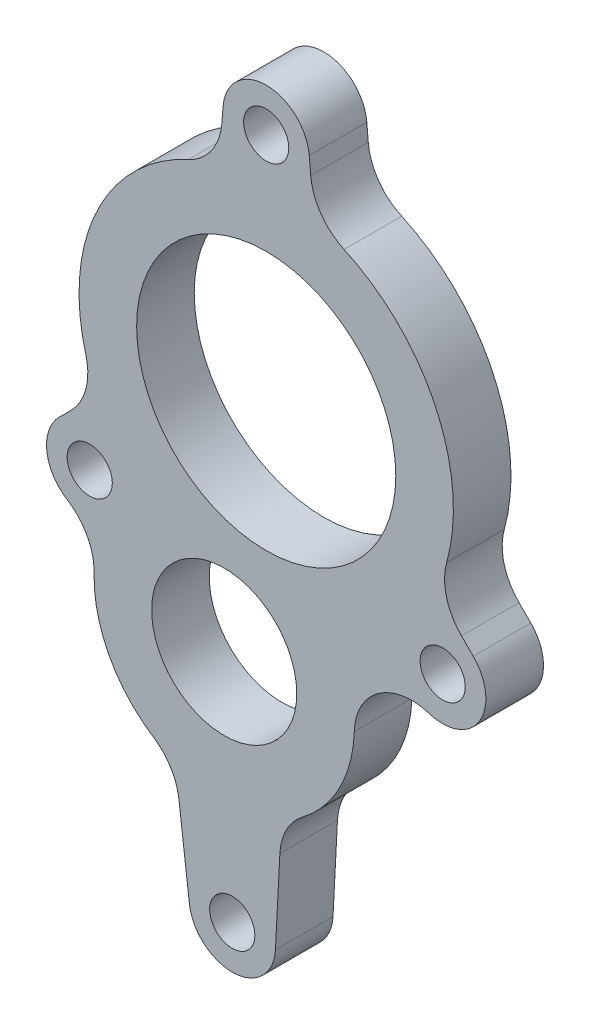
ISO-10303-21;
HEADER;
FILE_DESCRIPTION(('STEP AP214'),'2;1');
FILE_NAME('part.step','',(''),(''),'','','');
FILE_SCHEMA(('AUTOMOTIVE_DESIGN { 1 0 10303 214 1 1 1 1 }'));
ENDSEC;
DATA;
#1=APPLICATION_CONTEXT('core data for automotive mechanical design processes');
#2=APPLICATION_PROTOCOL_DEFINITION('international standard','automotive_design',2000,#1);
#3=PRODUCT_CONTEXT('',#1,'mechanical');
#4=PRODUCT('Part','Part','',(#3));
#5=PRODUCT_RELATED_PRODUCT_CATEGORY('part','',(#4));
#6=PRODUCT_DEFINITION_FORMATION('','',#4);
#7=PRODUCT_DEFINITION_CONTEXT('part definition',#1,'design');
#8=PRODUCT_DEFINITION('design','',#6,#7);
#9=PRODUCT_DEFINITION_SHAPE('','',#8);
#10=(LENGTH_UNIT() NAMED_UNIT(*) SI_UNIT(.MILLI.,.METRE.));
#11=(NAMED_UNIT(*) PLANE_ANGLE_UNIT() SI_UNIT($,.RADIAN.));
#12=(NAMED_UNIT(*) SI_UNIT($,.STERADIAN.) SOLID_ANGLE_UNIT());
#13=UNCERTAINTY_MEASURE_WITH_UNIT(LENGTH_MEASURE(1.E-05),#10,'distance_accuracy_value','');
#14=(GEOMETRIC_REPRESENTATION_CONTEXT(3) GLOBAL_UNCERTAINTY_ASSIGNED_CONTEXT((#13)) GLOBAL_UNIT_ASSIGNED_CONTEXT((#10,
#11,#12)) REPRESENTATION_CONTEXT('',''));
#15=CARTESIAN_POINT('',(0.,0.,0.));
#16=DIRECTION('',(0.,0.,1.));
#17=DIRECTION('',(1.,0.,0.));
#18=AXIS2_PLACEMENT_3D('',#15,#16,#17);
#19=CARTESIAN_POINT('',(-19.457528855222,-16.3268052860382,3.175));
#20=DIRECTION('',(0.,0.,-1.));
#21=DIRECTION('',(-1.,0.,0.));
#22=AXIS2_PLACEMENT_3D('',#19,#20,#21);
#23=CYLINDRICAL_SURFACE('',#22,4.76250000000001);
#24=CARTESIAN_POINT('',(-19.457528855222,-16.3268052860382,-3.175));
#25=DIRECTION('',(0.,0.,1.));
#26=DIRECTION('',(1.,0.,0.));
#27=AXIS2_PLACEMENT_3D('',#24,#25,#26);
#28=CIRCLE('',#27,4.76250000000001);
#29=CARTESIAN_POINT('',(-22.8251249006229,-12.9592092406373,-3.175));
#30=VERTEX_POINT('',#29);
#31=CARTESIAN_POINT('',(-21.9726887974104,-20.3709834120869,-3.175));
#32=VERTEX_POINT('',#31);
#33=EDGE_CURVE('E345',#30,#32,#28,.T.);
#34=ORIENTED_EDGE('',*,*,#33,.T.);
#35=DIRECTION('',(0.,0.,-1.));
#36=VECTOR('',#35,1.);
#37=CARTESIAN_POINT('',(-21.9726887974104,-20.3709834120869,3.175));
#38=LINE('',#37,#36);
#39=CARTESIAN_POINT('',(-21.9726887974104,-20.3709834120869,3.175));
#40=VERTEX_POINT('',#39);
#41=EDGE_CURVE('E395',#32,#40,#38,.F.);
#42=ORIENTED_EDGE('',*,*,#41,.T.);
#43=CARTESIAN_POINT('',(-19.457528855222,-16.3268052860382,3.175));
#44=DIRECTION('',(0.,0.,1.));
#45=DIRECTION('',(1.,0.,0.));
#46=AXIS2_PLACEMENT_3D('',#43,#44,#45);
#47=CIRCLE('',#46,4.76250000000001);
#48=CARTESIAN_POINT('',(-22.8251249006229,-12.9592092406373,3.175));
#49=VERTEX_POINT('',#48);
#50=EDGE_CURVE('E299',#49,#40,#47,.T.);
#51=ORIENTED_EDGE('',*,*,#50,.F.);
#52=DIRECTION('',(0.,0.,-1.));
#53=VECTOR('',#52,1.);
#54=CARTESIAN_POINT('',(-22.8251249006229,-12.9592092406373,3.175));
#55=LINE('',#54,#53);
#56=EDGE_CURVE('E370',#49,#30,#55,.T.);
#57=ORIENTED_EDGE('',*,*,#56,.T.);
#58=EDGE_LOOP('',(#34,#42,#51,#57));
#59=FACE_BOUND('',#58,.T.);
#60=ADVANCED_FACE('F47',(#59),#23,.T.);
#61=CARTESIAN_POINT('',(0.,0.,3.175));
#62=DIRECTION('',(0.,0.,-1.));
#63=DIRECTION('',(-1.,0.,0.));
#64=AXIS2_PLACEMENT_3D('',#61,#62,#63);
#65=CYLINDRICAL_SURFACE('',#64,20.6375);
#66=CARTESIAN_POINT('',(0.,0.,-3.175));
#67=DIRECTION('',(0.,0.,1.));
#68=DIRECTION('',(1.,0.,0.));
#69=AXIS2_PLACEMENT_3D('',#66,#67,#68);
#70=CIRCLE('',#69,20.6375);
#71=CARTESIAN_POINT('',(19.8955843924159,-5.48380597160928,-3.175));
#72=VERTEX_POINT('',#71);
#73=CARTESIAN_POINT('',(8.58779604322396,18.7658243988903,-3.175));
#74=VERTEX_POINT('',#73);
#75=EDGE_CURVE('E326',#72,#74,#70,.T.);
#76=ORIENTED_EDGE('',*,*,#75,.T.);
#77=DIRECTION('',(0.,0.,-1.));
#78=VECTOR('',#77,1.);
#79=CARTESIAN_POINT('',(8.58779604322396,18.7658243988903,3.175));
#80=LINE('',#79,#78);
#81=CARTESIAN_POINT('',(8.58779604322396,18.7658243988903,3.175));
#82=VERTEX_POINT('',#81);
#83=EDGE_CURVE('E420',#74,#82,#80,.F.);
#84=ORIENTED_EDGE('',*,*,#83,.T.);
#85=CARTESIAN_POINT('',(0.,0.,3.175));
#86=DIRECTION('',(0.,0.,1.));
#87=DIRECTION('',(1.,0.,0.));
#88=AXIS2_PLACEMENT_3D('',#85,#86,#87);
#89=CIRCLE('',#88,20.6375);
#90=CARTESIAN_POINT('',(19.8955843924159,-5.48380597160928,3.175));
#91=VERTEX_POINT('',#90);
#92=EDGE_CURVE('E279',#91,#82,#89,.T.);
#93=ORIENTED_EDGE('',*,*,#92,.F.);
#94=DIRECTION('',(0.,0.,-1.));
#95=VECTOR('',#94,1.);
#96=CARTESIAN_POINT('',(19.8955843924159,-5.48380597160928,3.175));
#97=LINE('',#96,#95);
#98=EDGE_CURVE('E416',#91,#72,#97,.T.);
#99=ORIENTED_EDGE('',*,*,#98,.T.);
#100=EDGE_LOOP('',(#76,#84,#93,#99));
#101=FACE_BOUND('',#100,.T.);
#102=ADVANCED_FACE('F482',(#101),#65,.T.);
#103=CARTESIAN_POINT('',(6.94970910603179,0.608020761580617,3.175));
#104=DIRECTION('',(0.996194698091746,0.0871557427476514,0.));
#105=DIRECTION('',(-0.0871557427476514,0.996194698091746,0.));
#106=AXIS2_PLACEMENT_3D('',#103,#104,#105);
#107=PLANE('',#106);
#108=DIRECTION('',(0.0871557427476514,-0.996194698091746,0.));
#109=VECTOR('',#108,1.);
#110=CARTESIAN_POINT('',(6.94970910603179,0.608020761580617,3.175));
#111=LINE('',#110,#109);
#112=CARTESIAN_POINT('',(4.74437724966195,25.8150792248357,3.175));
#113=VERTEX_POINT('',#112);
#114=CARTESIAN_POINT('',(4.90435849287182,23.9864852474859,3.175));
#115=VERTEX_POINT('',#114);
#116=EDGE_CURVE('E284',#113,#115,#111,.T.);
#117=ORIENTED_EDGE('',*,*,#116,.T.);
#118=DIRECTION('',(0.,0.,-1.));
#119=VECTOR('',#118,1.);
#120=CARTESIAN_POINT('',(4.90435849287182,23.9864852474859,3.175));
#121=LINE('',#120,#119);
#122=CARTESIAN_POINT('',(4.90435849287182,23.9864852474859,-3.175));
#123=VERTEX_POINT('',#122);
#124=EDGE_CURVE('E412',#115,#123,#121,.T.);
#125=ORIENTED_EDGE('',*,*,#124,.T.);
#126=DIRECTION('',(0.0871557427476514,-0.996194698091746,0.));
#127=VECTOR('',#126,1.);
#128=CARTESIAN_POINT('',(6.94970910603179,0.608020761580617,-3.175));
#129=LINE('',#128,#127);
#130=CARTESIAN_POINT('',(4.74437724966195,25.8150792248357,-3.175));
#131=VERTEX_POINT('',#130);
#132=EDGE_CURVE('E330',#131,#123,#129,.T.);
#133=ORIENTED_EDGE('',*,*,#132,.F.);
#134=DIRECTION('',(0.,0.,-1.));
#135=VECTOR('',#134,1.);
#136=CARTESIAN_POINT('',(4.74437724966195,25.8150792248357,3.175));
#137=LINE('',#136,#135);
#138=EDGE_CURVE('E378',#113,#131,#137,.T.);
#139=ORIENTED_EDGE('',*,*,#138,.F.);
#140=EDGE_LOOP('',(#117,#125,#133,#139));
#141=FACE_BOUND('',#140,.T.);
#142=ADVANCED_FACE('F489',(#141),#107,.T.);
#143=CARTESIAN_POINT('',(0.,25.4,3.175));
#144=DIRECTION('',(0.,0.,-1.));
#145=DIRECTION('',(-1.,0.,0.));
#146=AXIS2_PLACEMENT_3D('',#143,#144,#145);
#147=CYLINDRICAL_SURFACE('',#146,4.76250000000001);
#148=CARTESIAN_POINT('',(0.,25.4,-3.175));
#149=DIRECTION('',(0.,0.,1.));
#150=DIRECTION('',(1.,0.,0.));
#151=AXIS2_PLACEMENT_3D('',#148,#149,#150);
#152=CIRCLE('',#151,4.76250000000001);
#153=CARTESIAN_POINT('',(-4.74437724966195,25.8150792248357,-3.175));
#154=VERTEX_POINT('',#153);
#155=EDGE_CURVE('E335',#131,#154,#152,.T.);
#156=ORIENTED_EDGE('',*,*,#155,.T.);
#157=DIRECTION('',(0.,0.,-1.));
#158=VECTOR('',#157,1.);
#159=CARTESIAN_POINT('',(-4.74437724966195,25.8150792248357,3.175));
#160=LINE('',#159,#158);
#161=CARTESIAN_POINT('',(-4.74437724966195,25.8150792248357,3.175));
#162=VERTEX_POINT('',#161);
#163=EDGE_CURVE('E374',#162,#154,#160,.T.);
#164=ORIENTED_EDGE('',*,*,#163,.F.);
#165=CARTESIAN_POINT('',(0.,25.4,3.175));
#166=DIRECTION('',(0.,0.,1.));
#167=DIRECTION('',(1.,0.,0.));
#168=AXIS2_PLACEMENT_3D('',#165,#166,#167);
#169=CIRCLE('',#168,4.76250000000001);
#170=EDGE_CURVE('E289',#113,#162,#169,.T.);
#171=ORIENTED_EDGE('',*,*,#170,.F.);
#172=ORIENTED_EDGE('',*,*,#138,.T.);
#173=EDGE_LOOP('',(#156,#164,#171,#172));
#174=FACE_BOUND('',#173,.T.);
#175=ADVANCED_FACE('F503',(#174),#147,.T.);
#176=CARTESIAN_POINT('',(-6.94970910603178,0.608020761580613,3.175));
#177=DIRECTION('',(0.996194698091746,-0.0871557427476509,0.));
#178=DIRECTION('',(0.0871557427476509,0.996194698091746,0.));
#179=AXIS2_PLACEMENT_3D('',#176,#177,#178);
#180=PLANE('',#179);
#181=DIRECTION('',(-0.0871557427476509,-0.996194698091746,0.));
#182=VECTOR('',#181,1.);
#183=CARTESIAN_POINT('',(-6.94970910603178,0.608020761580613,-3.175));
#184=LINE('',#183,#182);
#185=CARTESIAN_POINT('',(-4.90435849287182,23.9864852474859,-3.175));
#186=VERTEX_POINT('',#185);
#187=EDGE_CURVE('E338',#154,#186,#184,.T.);
#188=ORIENTED_EDGE('',*,*,#187,.T.);
#189=DIRECTION('',(0.,0.,1.));
#190=VECTOR('',#189,1.);
#191=CARTESIAN_POINT('',(-4.90435849287182,23.9864852474859,3.175));
#192=LINE('',#191,#190);
#193=CARTESIAN_POINT('',(-4.90435849287182,23.9864852474859,3.175));
#194=VERTEX_POINT('',#193);
#195=EDGE_CURVE('E409',#186,#194,#192,.T.);
#196=ORIENTED_EDGE('',*,*,#195,.T.);
#197=DIRECTION('',(-0.0871557427476509,-0.996194698091746,0.));
#198=VECTOR('',#197,1.);
#199=CARTESIAN_POINT('',(-6.94970910603178,0.608020761580613,3.175));
#200=LINE('',#199,#198);
#201=EDGE_CURVE('E292',#162,#194,#200,.T.);
#202=ORIENTED_EDGE('',*,*,#201,.F.);
#203=ORIENTED_EDGE('',*,*,#163,.T.);
#204=EDGE_LOOP('',(#188,#196,#202,#203));
#205=FACE_BOUND('',#204,.T.);
#206=ADVANCED_FACE('F500',(#205),#180,.F.);
#207=CARTESIAN_POINT('',(-8.58779604322395,18.7658243988903,-3.175));
#208=VERTEX_POINT('',#207);
#209=CARTESIAN_POINT('',(-19.8955843924159,-5.48380597160927,-3.175));
#210=VERTEX_POINT('',#209);
#211=EDGE_CURVE('E331',#208,#210,#70,.T.);
#212=ORIENTED_EDGE('',*,*,#211,.T.);
#213=DIRECTION('',(0.,0.,-1.));
#214=VECTOR('',#213,1.);
#215=CARTESIAN_POINT('',(-19.8955843924159,-5.48380597160927,3.175));
#216=LINE('',#215,#214);
#217=CARTESIAN_POINT('',(-19.8955843924159,-5.48380597160927,3.175));
#218=VERTEX_POINT('',#217);
#219=EDGE_CURVE('E406',#210,#218,#216,.F.);
#220=ORIENTED_EDGE('',*,*,#219,.T.);
#221=CARTESIAN_POINT('',(-8.58779604322395,18.7658243988903,3.175));
#222=VERTEX_POINT('',#221);
#223=EDGE_CURVE('E285',#222,#218,#89,.T.);
#224=ORIENTED_EDGE('',*,*,#223,.F.);
#225=DIRECTION('',(0.,0.,-1.));
#226=VECTOR('',#225,1.);
#227=CARTESIAN_POINT('',(-8.58779604322395,18.7658243988903,3.175));
#228=LINE('',#227,#226);
#229=EDGE_CURVE('E402',#222,#208,#228,.T.);
#230=ORIENTED_EDGE('',*,*,#229,.T.);
#231=EDGE_LOOP('',(#212,#220,#224,#230));
#232=FACE_BOUND('',#231,.T.);
#233=ADVANCED_FACE('F492',(#232),#65,.T.);
#234=CARTESIAN_POINT('',(-4.93295782999295,4.93295782999289,3.175));
#235=DIRECTION('',(0.707106781186551,-0.707106781186544,0.));
#236=DIRECTION('',(0.707106781186544,0.707106781186551,0.));
#237=AXIS2_PLACEMENT_3D('',#234,#235,#236);
#238=PLANE('',#237);
#239=DIRECTION('',(-0.707106781186544,-0.707106781186551,0.));
#240=VECTOR('',#239,1.);
#241=CARTESIAN_POINT('',(-4.93295782999295,4.93295782999289,3.175));
#242=LINE('',#241,#240);
#243=CARTESIAN_POINT('',(-21.5271746064708,-11.6612589464851,3.175));
#244=VERTEX_POINT('',#243);
#245=EDGE_CURVE('E296',#244,#49,#242,.T.);
#246=ORIENTED_EDGE('',*,*,#245,.F.);
#247=DIRECTION('',(0.,0.,1.));
#248=VECTOR('',#247,1.);
#249=CARTESIAN_POINT('',(-21.5271746064708,-11.6612589464851,-3.175));
#250=LINE('',#249,#248);
#251=CARTESIAN_POINT('',(-21.5271746064708,-11.6612589464851,-3.175));
#252=VERTEX_POINT('',#251);
#253=EDGE_CURVE('E398',#244,#252,#250,.F.);
#254=ORIENTED_EDGE('',*,*,#253,.T.);
#255=DIRECTION('',(-0.707106781186544,-0.707106781186551,0.));
#256=VECTOR('',#255,1.);
#257=CARTESIAN_POINT('',(-4.93295782999295,4.93295782999289,-3.175));
#258=LINE('',#257,#256);
#259=EDGE_CURVE('E342',#252,#30,#258,.T.);
#260=ORIENTED_EDGE('',*,*,#259,.T.);
#261=ORIENTED_EDGE('',*,*,#56,.F.);
#262=EDGE_LOOP('',(#246,#254,#260,#261));
#263=FACE_BOUND('',#262,.T.);
#264=ADVANCED_FACE('F495',(#263),#238,.F.);
#265=CARTESIAN_POINT('',(19.457528855222,-16.3268052860382,3.175));
#266=DIRECTION('',(0.,0.,-1.));
#267=DIRECTION('',(-1.,0.,0.));
#268=AXIS2_PLACEMENT_3D('',#265,#266,#267);
#269=CYLINDRICAL_SURFACE('',#268,4.76250000000001);
#270=CARTESIAN_POINT('',(19.457528855222,-16.3268052860382,3.175));
#271=DIRECTION('',(0.,0.,1.));
#272=DIRECTION('',(1.,0.,0.));
#273=AXIS2_PLACEMENT_3D('',#270,#271,#272);
#274=CIRCLE('',#273,4.76250000000001);
#275=CARTESIAN_POINT('',(18.0004757256384,-20.8609427373701,3.175));
#276=VERTEX_POINT('',#275);
#277=CARTESIAN_POINT('',(22.8251249006229,-12.9592092406372,3.175));
#278=VERTEX_POINT('',#277);
#279=EDGE_CURVE('E303',#276,#278,#274,.T.);
#280=ORIENTED_EDGE('',*,*,#279,.F.);
#281=DIRECTION('',(0.,0.,-1.));
#282=VECTOR('',#281,1.);
#283=CARTESIAN_POINT('',(18.0004757256384,-20.8609427373701,3.175));
#284=LINE('',#283,#282);
#285=CARTESIAN_POINT('',(18.0004757256384,-20.8609427373701,-3.175));
#286=VERTEX_POINT('',#285);
#287=EDGE_CURVE('E241',#276,#286,#284,.T.);
#288=ORIENTED_EDGE('',*,*,#287,.T.);
#289=CARTESIAN_POINT('',(19.457528855222,-16.3268052860382,-3.175));
#290=DIRECTION('',(0.,0.,1.));
#291=DIRECTION('',(1.,0.,0.));
#292=AXIS2_PLACEMENT_3D('',#289,#290,#291);
#293=CIRCLE('',#292,4.76250000000001);
#294=CARTESIAN_POINT('',(22.8251249006229,-12.9592092406372,-3.175));
#295=VERTEX_POINT('',#294);
#296=EDGE_CURVE('E349',#286,#295,#293,.T.);
#297=ORIENTED_EDGE('',*,*,#296,.T.);
#298=DIRECTION('',(0.,0.,-1.));
#299=VECTOR('',#298,1.);
#300=CARTESIAN_POINT('',(22.8251249006229,-12.9592092406372,3.175));
#301=LINE('',#300,#299);
#302=EDGE_CURVE('E322',#278,#295,#301,.T.);
#303=ORIENTED_EDGE('',*,*,#302,.F.);
#304=EDGE_LOOP('',(#280,#288,#297,#303));
#305=FACE_BOUND('',#304,.T.);
#306=ADVANCED_FACE('F498',(#305),#269,.T.);
#307=CARTESIAN_POINT('',(-19.457528855222,-16.3268052860382,3.175));
#308=DIRECTION('',(0.,0.,-1.));
#309=DIRECTION('',(-1.,0.,0.));
#310=AXIS2_PLACEMENT_3D('',#307,#308,#309);
#311=CYLINDRICAL_SURFACE('',#310,2.4892);
#312=CARTESIAN_POINT('',(-19.457528855222,-16.3268052860382,3.175));
#313=DIRECTION('',(0.,0.,1.));
#314=DIRECTION('',(1.,0.,0.));
#315=AXIS2_PLACEMENT_3D('',#312,#313,#314);
#316=CIRCLE('',#315,2.4892);
#317=CARTESIAN_POINT('',(-16.968328855222,-16.3268052860382,3.175));
#318=VERTEX_POINT('',#317);
#319=EDGE_CURVE('E314',#318,#318,#316,.T.);
#320=ORIENTED_EDGE('',*,*,#319,.T.);
#321=EDGE_LOOP('',(#320));
#322=FACE_BOUND('',#321,.T.);
#323=CARTESIAN_POINT('',(-19.457528855222,-16.3268052860382,-3.175));
#324=DIRECTION('',(0.,0.,1.));
#325=DIRECTION('',(1.,0.,0.));
#326=AXIS2_PLACEMENT_3D('',#323,#324,#325);
#327=CIRCLE('',#326,2.4892);
#328=CARTESIAN_POINT('',(-16.968328855222,-16.3268052860382,-3.175));
#329=VERTEX_POINT('',#328);
#330=EDGE_CURVE('E360',#329,#329,#327,.T.);
#331=ORIENTED_EDGE('',*,*,#330,.F.);
#332=EDGE_LOOP('',(#331));
#333=FACE_BOUND('',#332,.T.);
#334=ADVANCED_FACE('F589',(#322,#333),#311,.F.);
#335=CARTESIAN_POINT('',(0.,25.4,3.175));
#336=DIRECTION('',(0.,0.,-1.));
#337=DIRECTION('',(-1.,0.,0.));
#338=AXIS2_PLACEMENT_3D('',#335,#336,#337);
#339=CYLINDRICAL_SURFACE('',#338,2.48920000000001);
#340=CARTESIAN_POINT('',(0.,25.4,3.175));
#341=DIRECTION('',(0.,0.,1.));
#342=DIRECTION('',(1.,0.,0.));
#343=AXIS2_PLACEMENT_3D('',#340,#341,#342);
#344=CIRCLE('',#343,2.48920000000001);
#345=CARTESIAN_POINT('',(2.48920000000001,25.4,3.175));
#346=VERTEX_POINT('',#345);
#347=EDGE_CURVE('E310',#346,#346,#344,.T.);
#348=ORIENTED_EDGE('',*,*,#347,.T.);
#349=EDGE_LOOP('',(#348));
#350=FACE_BOUND('',#349,.T.);
#351=CARTESIAN_POINT('',(0.,25.4,-3.175));
#352=DIRECTION('',(0.,0.,1.));
#353=DIRECTION('',(1.,0.,0.));
#354=AXIS2_PLACEMENT_3D('',#351,#352,#353);
#355=CIRCLE('',#354,2.48920000000001);
#356=CARTESIAN_POINT('',(2.48920000000001,25.4,-3.175));
#357=VERTEX_POINT('',#356);
#358=EDGE_CURVE('E356',#357,#357,#355,.T.);
#359=ORIENTED_EDGE('',*,*,#358,.F.);
#360=EDGE_LOOP('',(#359));
#361=FACE_BOUND('',#360,.T.);
#362=ADVANCED_FACE('F583',(#350,#361),#339,.F.);
#363=CARTESIAN_POINT('',(4.9329578299927,4.93295782999275,3.175));
#364=DIRECTION('',(-0.707106781186544,-0.707106781186551,0.));
#365=DIRECTION('',(0.707106781186551,-0.707106781186544,0.));
#366=AXIS2_PLACEMENT_3D('',#363,#364,#365);
#367=PLANE('',#366);
#368=DIRECTION('',(-0.707106781186551,0.707106781186544,0.));
#369=VECTOR('',#368,1.);
#370=CARTESIAN_POINT('',(4.9329578299927,4.93295782999275,-3.175));
#371=LINE('',#370,#369);
#372=CARTESIAN_POINT('',(21.5271746064708,-11.6612589464852,-3.175));
#373=VERTEX_POINT('',#372);
#374=EDGE_CURVE('E352',#295,#373,#371,.T.);
#375=ORIENTED_EDGE('',*,*,#374,.T.);
#376=DIRECTION('',(0.,0.,1.));
#377=VECTOR('',#376,1.);
#378=CARTESIAN_POINT('',(21.5271746064708,-11.6612589464852,3.175));
#379=LINE('',#378,#377);
#380=CARTESIAN_POINT('',(21.5271746064708,-11.6612589464852,3.175));
#381=VERTEX_POINT('',#380);
#382=EDGE_CURVE('E423',#373,#381,#379,.T.);
#383=ORIENTED_EDGE('',*,*,#382,.T.);
#384=DIRECTION('',(-0.707106781186551,0.707106781186544,0.));
#385=VECTOR('',#384,1.);
#386=CARTESIAN_POINT('',(4.9329578299927,4.93295782999275,3.175));
#387=LINE('',#386,#385);
#388=EDGE_CURVE('E306',#278,#381,#387,.T.);
#389=ORIENTED_EDGE('',*,*,#388,.F.);
#390=ORIENTED_EDGE('',*,*,#302,.T.);
#391=EDGE_LOOP('',(#375,#383,#389,#390));
#392=FACE_BOUND('',#391,.T.);
#393=ADVANCED_FACE('F515',(#392),#367,.F.);
#394=CARTESIAN_POINT('',(0.,0.,3.175));
#395=DIRECTION('',(0.,0.,-1.));
#396=DIRECTION('',(-1.,0.,0.));
#397=AXIS2_PLACEMENT_3D('',#394,#395,#396);
#398=CYLINDRICAL_SURFACE('',#397,14.2875);
#399=CARTESIAN_POINT('',(0.,0.,-3.175));
#400=DIRECTION('',(0.,0.,1.));
#401=DIRECTION('',(1.,0.,0.));
#402=AXIS2_PLACEMENT_3D('',#399,#400,#401);
#403=CIRCLE('',#402,14.2875);
#404=CARTESIAN_POINT('',(14.2875,0.,-3.175));
#405=VERTEX_POINT('',#404);
#406=EDGE_CURVE('E205',#405,#405,#403,.T.);
#407=ORIENTED_EDGE('',*,*,#406,.F.);
#408=EDGE_LOOP('',(#407));
#409=FACE_BOUND('',#408,.T.);
#410=CARTESIAN_POINT('',(0.,0.,3.175));
#411=DIRECTION('',(0.,0.,1.));
#412=DIRECTION('',(1.,0.,0.));
#413=AXIS2_PLACEMENT_3D('',#410,#411,#412);
#414=CIRCLE('',#413,14.2875);
#415=CARTESIAN_POINT('',(14.2875,0.,3.175));
#416=VERTEX_POINT('',#415);
#417=EDGE_CURVE('E275',#416,#416,#414,.T.);
#418=ORIENTED_EDGE('',*,*,#417,.T.);
#419=EDGE_LOOP('',(#418));
#420=FACE_BOUND('',#419,.T.);
#421=ADVANCED_FACE('F511',(#409,#420),#398,.F.);
#422=CARTESIAN_POINT('',(19.457528855222,-16.3268052860382,3.175));
#423=DIRECTION('',(0.,0.,-1.));
#424=DIRECTION('',(-1.,0.,0.));
#425=AXIS2_PLACEMENT_3D('',#422,#423,#424);
#426=CYLINDRICAL_SURFACE('',#425,2.4892);
#427=CARTESIAN_POINT('',(19.457528855222,-16.3268052860382,3.175));
#428=DIRECTION('',(0.,0.,1.));
#429=DIRECTION('',(1.,0.,0.));
#430=AXIS2_PLACEMENT_3D('',#427,#428,#429);
#431=CIRCLE('',#430,2.4892);
#432=CARTESIAN_POINT('',(21.946728855222,-16.3268052860382,3.175));
#433=VERTEX_POINT('',#432);
#434=EDGE_CURVE('E318',#433,#433,#431,.T.);
#435=ORIENTED_EDGE('',*,*,#434,.T.);
#436=EDGE_LOOP('',(#435));
#437=FACE_BOUND('',#436,.T.);
#438=CARTESIAN_POINT('',(19.457528855222,-16.3268052860382,-3.175));
#439=DIRECTION('',(0.,0.,1.));
#440=DIRECTION('',(1.,0.,0.));
#441=AXIS2_PLACEMENT_3D('',#438,#439,#440);
#442=CIRCLE('',#441,2.4892);
#443=CARTESIAN_POINT('',(21.946728855222,-16.3268052860382,-3.175));
#444=VERTEX_POINT('',#443);
#445=EDGE_CURVE('E280',#444,#444,#442,.T.);
#446=ORIENTED_EDGE('',*,*,#445,.F.);
#447=EDGE_LOOP('',(#446));
#448=FACE_BOUND('',#447,.T.);
#449=ADVANCED_FACE('F514',(#437,#448),#426,.F.);
#450=CARTESIAN_POINT('',(0.,0.,3.175));
#451=DIRECTION('',(0.,0.,1.));
#452=DIRECTION('',(1.,0.,0.));
#453=AXIS2_PLACEMENT_3D('',#450,#451,#452);
#454=PLANE('',#453);
#455=CARTESIAN_POINT('',(-4.63230892650561,-26.264626668,3.175));
#456=DIRECTION('',(0.,0.,1.));
#457=DIRECTION('',(1.,0.,0.));
#458=AXIS2_PLACEMENT_3D('',#455,#456,#457);
#459=CIRCLE('',#458,8.000000002);
#460=CARTESIAN_POINT('',(3.36769107549439,-26.264626668,3.175));
#461=VERTEX_POINT('',#460);
#462=EDGE_CURVE('E233',#461,#461,#459,.T.);
#463=ORIENTED_EDGE('',*,*,#462,.F.);
#464=EDGE_LOOP('',(#463));
#465=FACE_BOUND('',#464,.T.);
#466=ORIENTED_EDGE('',*,*,#417,.F.);
#467=EDGE_LOOP('',(#466));
#468=FACE_BOUND('',#467,.T.);
#469=CARTESIAN_POINT('',(16.0577382195269,-26.906459339146,3.175));
#470=DIRECTION('',(0.,0.,1.));
#471=DIRECTION('',(1.,0.,0.));
#472=AXIS2_PLACEMENT_3D('',#469,#470,#471);
#473=CIRCLE('',#472,6.35);
#474=CARTESIAN_POINT('',(9.71079139031859,-26.7095686405285,3.175));
#475=VERTEX_POINT('',#474);
#476=EDGE_CURVE('E230',#475,#276,#473,.F.);
#477=ORIENTED_EDGE('',*,*,#476,.T.);
#478=ORIENTED_EDGE('',*,*,#279,.T.);
#479=ORIENTED_EDGE('',*,*,#388,.T.);
#480=CARTESIAN_POINT('',(26.0173026670054,-7.1711308859506,3.175));
#481=DIRECTION('',(0.,0.,1.));
#482=DIRECTION('',(1.,0.,0.));
#483=AXIS2_PLACEMENT_3D('',#480,#481,#482);
#484=CIRCLE('',#483,6.35);
#485=EDGE_CURVE('E462',#381,#91,#484,.F.);
#486=ORIENTED_EDGE('',*,*,#485,.T.);
#487=ORIENTED_EDGE('',*,*,#92,.T.);
#488=CARTESIAN_POINT('',(11.2301948257544,24.5399242139335,3.175));
#489=DIRECTION('',(0.,0.,1.));
#490=DIRECTION('',(1.,0.,0.));
#491=AXIS2_PLACEMENT_3D('',#488,#489,#490);
#492=CIRCLE('',#491,6.35);
#493=EDGE_CURVE('E456',#82,#115,#492,.F.);
#494=ORIENTED_EDGE('',*,*,#493,.T.);
#495=ORIENTED_EDGE('',*,*,#116,.F.);
#496=ORIENTED_EDGE('',*,*,#170,.T.);
#497=ORIENTED_EDGE('',*,*,#201,.T.);
#498=CARTESIAN_POINT('',(-11.2301948257544,24.5399242139335,3.175));
#499=DIRECTION('',(0.,0.,1.));
#500=DIRECTION('',(1.,0.,0.));
#501=AXIS2_PLACEMENT_3D('',#498,#499,#500);
#502=CIRCLE('',#501,6.35);
#503=EDGE_CURVE('E450',#194,#222,#502,.F.);
#504=ORIENTED_EDGE('',*,*,#503,.T.);
#505=ORIENTED_EDGE('',*,*,#223,.T.);
#506=CARTESIAN_POINT('',(-26.0173026670054,-7.17113088595058,3.175));
#507=DIRECTION('',(0.,0.,1.));
#508=DIRECTION('',(1.,0.,0.));
#509=AXIS2_PLACEMENT_3D('',#506,#507,#508);
#510=CIRCLE('',#509,6.35);
#511=EDGE_CURVE('E444',#218,#244,#510,.F.);
#512=ORIENTED_EDGE('',*,*,#511,.T.);
#513=ORIENTED_EDGE('',*,*,#245,.T.);
#514=ORIENTED_EDGE('',*,*,#50,.T.);
#515=CARTESIAN_POINT('',(-25.3262353869949,-25.7632209134852,3.175));
#516=DIRECTION('',(0.,0.,1.));
#517=DIRECTION('',(1.,0.,0.));
#518=AXIS2_PLACEMENT_3D('',#515,#516,#517);
#519=CIRCLE('',#518,6.35);
#520=CARTESIAN_POINT('',(-18.9780985265403,-25.9170337898553,3.175));
#521=VERTEX_POINT('',#520);
#522=EDGE_CURVE('E438',#40,#521,#519,.F.);
#523=ORIENTED_EDGE('',*,*,#522,.T.);
#524=CARTESIAN_POINT('',(-4.63230892650561,-26.264626668,3.175));
#525=DIRECTION('',(0.,0.,1.));
#526=DIRECTION('',(1.,0.,0.));
#527=AXIS2_PLACEMENT_3D('',#524,#525,#526);
#528=CIRCLE('',#527,14.350000002);
#529=CARTESIAN_POINT('',(-12.4614634401072,-38.2907166252368,3.175));
#530=VERTEX_POINT('',#529);
#531=EDGE_CURVE('E221',#521,#530,#528,.T.);
#532=ORIENTED_EDGE('',*,*,#531,.T.);
#533=CARTESIAN_POINT('',(-15.9259325101031,-43.6123661874536,3.175));
#534=DIRECTION('',(0.,0.,1.));
#535=DIRECTION('',(1.,0.,0.));
#536=AXIS2_PLACEMENT_3D('',#533,#534,#535);
#537=CIRCLE('',#536,6.35);
#538=CARTESIAN_POINT('',(-9.62339426907728,-42.837439274508,3.175));
#539=VERTEX_POINT('',#538);
#540=EDGE_CURVE('E11',#530,#539,#537,.F.);
#541=ORIENTED_EDGE('',*,*,#540,.T.);
#542=DIRECTION('',(-0.122035734322145,0.992525707248157,0.));
#543=VECTOR('',#542,1.);
#544=CARTESIAN_POINT('',(-14.6687007588292,-1.80358619991688,3.175));
#545=LINE('',#544,#543);
#546=CARTESIAN_POINT('',(-8.46850988530317,-52.2301998963224,3.175));
#547=VERTEX_POINT('',#546);
#548=EDGE_CURVE('E199',#547,#539,#545,.T.);
#549=ORIENTED_EDGE('',*,*,#548,.F.);
#550=CARTESIAN_POINT('',(-3.74160620453382,-51.6490047116132,3.175));
#551=DIRECTION('',(0.,0.,1.));
#552=DIRECTION('',(1.,0.,0.));
#553=AXIS2_PLACEMENT_3D('',#550,#551,#552);
#554=CIRCLE('',#553,4.76250000000001);
#555=CARTESIAN_POINT('',(1.01440867272334,-51.8974573978708,3.175));
#556=VERTEX_POINT('',#555);
#557=EDGE_CURVE('E209',#547,#556,#554,.T.);
#558=ORIENTED_EDGE('',*,*,#557,.T.);
#559=DIRECTION('',(0.0521685430462243,0.998638294437197,0.));
#560=VECTOR('',#559,1.);
#561=CARTESIAN_POINT('',(3.71537594035515,-0.194090043168791,3.175));
#562=LINE('',#561,#560);
#563=CARTESIAN_POINT('',(1.50810534298953,-42.4468503466618,3.175));
#564=VERTEX_POINT('',#563);
#565=EDGE_CURVE('E215',#556,#564,#562,.T.);
#566=ORIENTED_EDGE('',*,*,#565,.T.);
#567=CARTESIAN_POINT('',(7.84945851266573,-42.7781205950053,3.175));
#568=DIRECTION('',(0.,0.,1.));
#569=DIRECTION('',(1.,0.,0.));
#570=AXIS2_PLACEMENT_3D('',#567,#568,#569);
#571=CIRCLE('',#570,6.35);
#572=CARTESIAN_POINT('',(4.02051053048795,-37.7123869512202,3.175));
#573=VERTEX_POINT('',#572);
#574=EDGE_CURVE('E432',#564,#573,#571,.F.);
#575=ORIENTED_EDGE('',*,*,#574,.T.);
#576=EDGE_CURVE('E226',#573,#475,#528,.T.);
#577=ORIENTED_EDGE('',*,*,#576,.T.);
#578=EDGE_LOOP('',(#477,#478,#479,#486,#487,#494,#495,#496,#497,#504,#505,#512,#513,#514,#523,
#532,#541,#549,#558,#566,#575,#577));
#579=FACE_BOUND('',#578,.T.);
#580=ORIENTED_EDGE('',*,*,#347,.F.);
#581=EDGE_LOOP('',(#580));
#582=FACE_BOUND('',#581,.T.);
#583=ORIENTED_EDGE('',*,*,#319,.F.);
#584=EDGE_LOOP('',(#583));
#585=FACE_BOUND('',#584,.T.);
#586=ORIENTED_EDGE('',*,*,#434,.F.);
#587=EDGE_LOOP('',(#586));
#588=FACE_BOUND('',#587,.T.);
#589=CARTESIAN_POINT('',(-3.74160620453382,-51.6490047116132,3.175));
#590=DIRECTION('',(0.,0.,1.));
#591=DIRECTION('',(1.,0.,0.));
#592=AXIS2_PLACEMENT_3D('',#589,#590,#591);
#593=CIRCLE('',#592,2.48920000000001);
#594=CARTESIAN_POINT('',(-1.25240620453381,-51.6490047116132,3.175));
#595=VERTEX_POINT('',#594);
#596=EDGE_CURVE('E237',#595,#595,#593,.T.);
#597=ORIENTED_EDGE('',*,*,#596,.F.);
#598=EDGE_LOOP('',(#597));
#599=FACE_BOUND('',#598,.T.);
#600=ADVANCED_FACE('F218',(#465,#468,#579,#582,#585,#588,#599),#454,.T.);
#601=CARTESIAN_POINT('',(0.,0.,-3.175));
#602=DIRECTION('',(0.,0.,1.));
#603=DIRECTION('',(1.,0.,0.));
#604=AXIS2_PLACEMENT_3D('',#601,#602,#603);
#605=PLANE('',#604);
#606=CARTESIAN_POINT('',(-4.63230892650561,-26.264626668,-3.175));
#607=DIRECTION('',(0.,0.,1.));
#608=DIRECTION('',(1.,0.,0.));
#609=AXIS2_PLACEMENT_3D('',#606,#607,#608);
#610=CIRCLE('',#609,8.000000002);
#611=CARTESIAN_POINT('',(3.36769107549439,-26.264626668,-3.175));
#612=VERTEX_POINT('',#611);
#613=EDGE_CURVE('E260',#612,#612,#610,.T.);
#614=ORIENTED_EDGE('',*,*,#613,.T.);
#615=EDGE_LOOP('',(#614));
#616=FACE_BOUND('',#615,.T.);
#617=ORIENTED_EDGE('',*,*,#406,.T.);
#618=EDGE_LOOP('',(#617));
#619=FACE_BOUND('',#618,.T.);
#620=ORIENTED_EDGE('',*,*,#296,.F.);
#621=CARTESIAN_POINT('',(16.0577382195269,-26.906459339146,-3.175));
#622=DIRECTION('',(0.,0.,1.));
#623=DIRECTION('',(1.,0.,0.));
#624=AXIS2_PLACEMENT_3D('',#621,#622,#623);
#625=CIRCLE('',#624,6.35);
#626=CARTESIAN_POINT('',(9.71079139031859,-26.7095686405285,-3.175));
#627=VERTEX_POINT('',#626);
#628=EDGE_CURVE('E256',#627,#286,#625,.F.);
#629=ORIENTED_EDGE('',*,*,#628,.F.);
#630=CARTESIAN_POINT('',(-4.63230892650561,-26.264626668,-3.175));
#631=DIRECTION('',(0.,0.,1.));
#632=DIRECTION('',(1.,0.,0.));
#633=AXIS2_PLACEMENT_3D('',#630,#631,#632);
#634=CIRCLE('',#633,14.350000002);
#635=CARTESIAN_POINT('',(4.02051053048795,-37.7123869512202,-3.175));
#636=VERTEX_POINT('',#635);
#637=EDGE_CURVE('E246',#636,#627,#634,.T.);
#638=ORIENTED_EDGE('',*,*,#637,.F.);
#639=CARTESIAN_POINT('',(7.84945851266573,-42.7781205950053,-3.175));
#640=DIRECTION('',(0.,0.,1.));
#641=DIRECTION('',(1.,0.,0.));
#642=AXIS2_PLACEMENT_3D('',#639,#640,#641);
#643=CIRCLE('',#642,6.35);
#644=CARTESIAN_POINT('',(1.50810534298953,-42.4468503466618,-3.175));
#645=VERTEX_POINT('',#644);
#646=EDGE_CURVE('E429',#636,#645,#643,.T.);
#647=ORIENTED_EDGE('',*,*,#646,.T.);
#648=DIRECTION('',(0.0521685430462243,0.998638294437197,0.));
#649=VECTOR('',#648,1.);
#650=CARTESIAN_POINT('',(3.71537594035515,-0.194090043168791,-3.175));
#651=LINE('',#650,#649);
#652=CARTESIAN_POINT('',(1.01440867272334,-51.8974573978708,-3.175));
#653=VERTEX_POINT('',#652);
#654=EDGE_CURVE('E252',#653,#645,#651,.T.);
#655=ORIENTED_EDGE('',*,*,#654,.F.);
#656=CARTESIAN_POINT('',(-3.74160620453382,-51.6490047116132,-3.175));
#657=DIRECTION('',(0.,0.,1.));
#658=DIRECTION('',(1.,0.,0.));
#659=AXIS2_PLACEMENT_3D('',#656,#657,#658);
#660=CIRCLE('',#659,4.76250000000001);
#661=CARTESIAN_POINT('',(-8.46850988530317,-52.2301998963224,-3.175));
#662=VERTEX_POINT('',#661);
#663=EDGE_CURVE('E249',#662,#653,#660,.T.);
#664=ORIENTED_EDGE('',*,*,#663,.F.);
#665=DIRECTION('',(-0.122035734322145,0.992525707248157,0.));
#666=VECTOR('',#665,1.);
#667=CARTESIAN_POINT('',(-14.6687007588292,-1.80358619991688,-3.175));
#668=LINE('',#667,#666);
#669=CARTESIAN_POINT('',(-9.62339426907728,-42.837439274508,-3.175));
#670=VERTEX_POINT('',#669);
#671=EDGE_CURVE('E201',#662,#670,#668,.T.);
#672=ORIENTED_EDGE('',*,*,#671,.T.);
#673=CARTESIAN_POINT('',(-15.9259325101031,-43.6123661874536,-3.175));
#674=DIRECTION('',(0.,0.,1.));
#675=DIRECTION('',(1.,0.,0.));
#676=AXIS2_PLACEMENT_3D('',#673,#674,#675);
#677=CIRCLE('',#676,6.35);
#678=CARTESIAN_POINT('',(-12.4614634401072,-38.2907166252368,-3.175));
#679=VERTEX_POINT('',#678);
#680=EDGE_CURVE('E56',#670,#679,#677,.T.);
#681=ORIENTED_EDGE('',*,*,#680,.T.);
#682=CARTESIAN_POINT('',(-18.9780985265403,-25.9170337898553,-3.175));
#683=VERTEX_POINT('',#682);
#684=EDGE_CURVE('E242',#683,#679,#634,.T.);
#685=ORIENTED_EDGE('',*,*,#684,.F.);
#686=CARTESIAN_POINT('',(-25.3262353869949,-25.7632209134852,-3.175));
#687=DIRECTION('',(0.,0.,1.));
#688=DIRECTION('',(1.,0.,0.));
#689=AXIS2_PLACEMENT_3D('',#686,#687,#688);
#690=CIRCLE('',#689,6.35);
#691=EDGE_CURVE('E435',#683,#32,#690,.T.);
#692=ORIENTED_EDGE('',*,*,#691,.T.);
#693=ORIENTED_EDGE('',*,*,#33,.F.);
#694=ORIENTED_EDGE('',*,*,#259,.F.);
#695=CARTESIAN_POINT('',(-26.0173026670054,-7.17113088595058,-3.175));
#696=DIRECTION('',(0.,0.,1.));
#697=DIRECTION('',(1.,0.,0.));
#698=AXIS2_PLACEMENT_3D('',#695,#696,#697);
#699=CIRCLE('',#698,6.35);
#700=EDGE_CURVE('E441',#252,#210,#699,.T.);
#701=ORIENTED_EDGE('',*,*,#700,.T.);
#702=ORIENTED_EDGE('',*,*,#211,.F.);
#703=CARTESIAN_POINT('',(-11.2301948257544,24.5399242139335,-3.175));
#704=DIRECTION('',(0.,0.,1.));
#705=DIRECTION('',(1.,0.,0.));
#706=AXIS2_PLACEMENT_3D('',#703,#704,#705);
#707=CIRCLE('',#706,6.35);
#708=EDGE_CURVE('E447',#208,#186,#707,.T.);
#709=ORIENTED_EDGE('',*,*,#708,.T.);
#710=ORIENTED_EDGE('',*,*,#187,.F.);
#711=ORIENTED_EDGE('',*,*,#155,.F.);
#712=ORIENTED_EDGE('',*,*,#132,.T.);
#713=CARTESIAN_POINT('',(11.2301948257544,24.5399242139335,-3.175));
#714=DIRECTION('',(0.,0.,1.));
#715=DIRECTION('',(1.,0.,0.));
#716=AXIS2_PLACEMENT_3D('',#713,#714,#715);
#717=CIRCLE('',#716,6.35);
#718=EDGE_CURVE('E453',#123,#74,#717,.T.);
#719=ORIENTED_EDGE('',*,*,#718,.T.);
#720=ORIENTED_EDGE('',*,*,#75,.F.);
#721=CARTESIAN_POINT('',(26.0173026670054,-7.1711308859506,-3.175));
#722=DIRECTION('',(0.,0.,1.));
#723=DIRECTION('',(1.,0.,0.));
#724=AXIS2_PLACEMENT_3D('',#721,#722,#723);
#725=CIRCLE('',#724,6.35);
#726=EDGE_CURVE('E459',#72,#373,#725,.T.);
#727=ORIENTED_EDGE('',*,*,#726,.T.);
#728=ORIENTED_EDGE('',*,*,#374,.F.);
#729=EDGE_LOOP('',(#620,#629,#638,#647,#655,#664,#672,#681,#685,#692,#693,#694,#701,#702,#709,
#710,#711,#712,#719,#720,#727,#728));
#730=FACE_BOUND('',#729,.T.);
#731=ORIENTED_EDGE('',*,*,#358,.T.);
#732=EDGE_LOOP('',(#731));
#733=FACE_BOUND('',#732,.T.);
#734=ORIENTED_EDGE('',*,*,#330,.T.);
#735=EDGE_LOOP('',(#734));
#736=FACE_BOUND('',#735,.T.);
#737=ORIENTED_EDGE('',*,*,#445,.T.);
#738=EDGE_LOOP('',(#737));
#739=FACE_BOUND('',#738,.T.);
#740=CARTESIAN_POINT('',(-3.74160620453382,-51.6490047116132,-3.175));
#741=DIRECTION('',(0.,0.,1.));
#742=DIRECTION('',(1.,0.,0.));
#743=AXIS2_PLACEMENT_3D('',#740,#741,#742);
#744=CIRCLE('',#743,2.48920000000001);
#745=CARTESIAN_POINT('',(-1.25240620453381,-51.6490047116132,-3.175));
#746=VERTEX_POINT('',#745);
#747=EDGE_CURVE('E224',#746,#746,#744,.T.);
#748=ORIENTED_EDGE('',*,*,#747,.T.);
#749=EDGE_LOOP('',(#748));
#750=FACE_BOUND('',#749,.T.);
#751=ADVANCED_FACE('F468',(#616,#619,#730,#733,#736,#739,#750),#605,.F.);
#752=CARTESIAN_POINT('',(-4.63230892650561,-26.264626668,3.175));
#753=DIRECTION('',(0.,0.,-1.));
#754=DIRECTION('',(-1.,0.,0.));
#755=AXIS2_PLACEMENT_3D('',#752,#753,#754);
#756=CYLINDRICAL_SURFACE('',#755,14.350000002);
#757=ORIENTED_EDGE('',*,*,#531,.F.);
#758=DIRECTION('',(0.,0.,-1.));
#759=VECTOR('',#758,1.);
#760=CARTESIAN_POINT('',(-18.9780985265403,-25.9170337898553,3.175));
#761=LINE('',#760,#759);
#762=EDGE_CURVE('E391',#521,#683,#761,.T.);
#763=ORIENTED_EDGE('',*,*,#762,.T.);
#764=ORIENTED_EDGE('',*,*,#684,.T.);
#765=DIRECTION('',(0.,0.,-1.));
#766=VECTOR('',#765,1.);
#767=CARTESIAN_POINT('',(-12.4614634401072,-38.2907166252368,3.175));
#768=LINE('',#767,#766);
#769=EDGE_CURVE('E388',#679,#530,#768,.F.);
#770=ORIENTED_EDGE('',*,*,#769,.T.);
#771=EDGE_LOOP('',(#757,#763,#764,#770));
#772=FACE_BOUND('',#771,.T.);
#773=ADVANCED_FACE('F472',(#772),#756,.T.);
#774=CARTESIAN_POINT('',(-4.63230892650561,-26.264626668,3.175));
#775=DIRECTION('',(0.,0.,-1.));
#776=DIRECTION('',(-1.,0.,0.));
#777=AXIS2_PLACEMENT_3D('',#774,#775,#776);
#778=CYLINDRICAL_SURFACE('',#777,8.000000002);
#779=ORIENTED_EDGE('',*,*,#613,.F.);
#780=EDGE_LOOP('',(#779));
#781=FACE_BOUND('',#780,.T.);
#782=ORIENTED_EDGE('',*,*,#462,.T.);
#783=EDGE_LOOP('',(#782));
#784=FACE_BOUND('',#783,.T.);
#785=ADVANCED_FACE('F612',(#781,#784),#778,.F.);
#786=CARTESIAN_POINT('',(-14.6687007588292,-1.80358619991688,3.175));
#787=DIRECTION('',(-0.992525707248157,-0.122035734322145,0.));
#788=DIRECTION('',(0.122035734322145,-0.992525707248157,0.));
#789=AXIS2_PLACEMENT_3D('',#786,#787,#788);
#790=PLANE('',#789);
#791=ORIENTED_EDGE('',*,*,#548,.T.);
#792=DIRECTION('',(0.,0.,-1.));
#793=VECTOR('',#792,1.);
#794=CARTESIAN_POINT('',(-9.62339426907728,-42.8374392745079,3.175));
#795=LINE('',#794,#793);
#796=EDGE_CURVE('E426',#539,#670,#795,.T.);
#797=ORIENTED_EDGE('',*,*,#796,.T.);
#798=ORIENTED_EDGE('',*,*,#671,.F.);
#799=DIRECTION('',(0.,0.,-1.));
#800=VECTOR('',#799,1.);
#801=CARTESIAN_POINT('',(-8.46850988530317,-52.2301998963224,3.175));
#802=LINE('',#801,#800);
#803=EDGE_CURVE('E196',#547,#662,#802,.T.);
#804=ORIENTED_EDGE('',*,*,#803,.F.);
#805=EDGE_LOOP('',(#791,#797,#798,#804));
#806=FACE_BOUND('',#805,.T.);
#807=ADVANCED_FACE('F198',(#806),#790,.T.);
#808=CARTESIAN_POINT('',(-3.74160620453382,-51.6490047116132,3.175));
#809=DIRECTION('',(0.,0.,-1.));
#810=DIRECTION('',(-1.,0.,0.));
#811=AXIS2_PLACEMENT_3D('',#808,#809,#810);
#812=CYLINDRICAL_SURFACE('',#811,4.76250000000001);
#813=ORIENTED_EDGE('',*,*,#663,.T.);
#814=DIRECTION('',(0.,0.,-1.));
#815=VECTOR('',#814,1.);
#816=CARTESIAN_POINT('',(1.01440867272334,-51.8974573978708,3.175));
#817=LINE('',#816,#815);
#818=EDGE_CURVE('E206',#556,#653,#817,.T.);
#819=ORIENTED_EDGE('',*,*,#818,.F.);
#820=ORIENTED_EDGE('',*,*,#557,.F.);
#821=ORIENTED_EDGE('',*,*,#803,.T.);
#822=EDGE_LOOP('',(#813,#819,#820,#821));
#823=FACE_BOUND('',#822,.T.);
#824=ADVANCED_FACE('F210',(#823),#812,.T.);
#825=CARTESIAN_POINT('',(3.71537594035515,-0.194090043168791,3.175));
#826=DIRECTION('',(-0.998638294437197,0.0521685430462243,0.));
#827=DIRECTION('',(-0.0521685430462243,-0.998638294437197,0.));
#828=AXIS2_PLACEMENT_3D('',#825,#826,#827);
#829=PLANE('',#828);
#830=ORIENTED_EDGE('',*,*,#654,.T.);
#831=DIRECTION('',(0.,0.,1.));
#832=VECTOR('',#831,1.);
#833=CARTESIAN_POINT('',(1.50810534298953,-42.4468503466618,3.175));
#834=LINE('',#833,#832);
#835=EDGE_CURVE('E385',#645,#564,#834,.T.);
#836=ORIENTED_EDGE('',*,*,#835,.T.);
#837=ORIENTED_EDGE('',*,*,#565,.F.);
#838=ORIENTED_EDGE('',*,*,#818,.T.);
#839=EDGE_LOOP('',(#830,#836,#837,#838));
#840=FACE_BOUND('',#839,.T.);
#841=ADVANCED_FACE('F615',(#840),#829,.F.);
#842=ORIENTED_EDGE('',*,*,#576,.F.);
#843=DIRECTION('',(0.,0.,-1.));
#844=VECTOR('',#843,1.);
#845=CARTESIAN_POINT('',(4.02051053048795,-37.7123869512202,3.175));
#846=LINE('',#845,#844);
#847=EDGE_CURVE('E381',#573,#636,#846,.T.);
#848=ORIENTED_EDGE('',*,*,#847,.T.);
#849=ORIENTED_EDGE('',*,*,#637,.T.);
#850=DIRECTION('',(0.,0.,-1.));
#851=VECTOR('',#850,1.);
#852=CARTESIAN_POINT('',(9.71079139031859,-26.7095686405285,3.175));
#853=LINE('',#852,#851);
#854=EDGE_CURVE('E269',#475,#627,#853,.T.);
#855=ORIENTED_EDGE('',*,*,#854,.F.);
#856=EDGE_LOOP('',(#842,#848,#849,#855));
#857=FACE_BOUND('',#856,.T.);
#858=ADVANCED_FACE('F568',(#857),#756,.T.);
#859=CARTESIAN_POINT('',(16.0577382195269,-26.906459339146,3.175));
#860=DIRECTION('',(0.,0.,-1.));
#861=DIRECTION('',(-1.,0.,0.));
#862=AXIS2_PLACEMENT_3D('',#859,#860,#861);
#863=CYLINDRICAL_SURFACE('',#862,6.35);
#864=ORIENTED_EDGE('',*,*,#628,.T.);
#865=ORIENTED_EDGE('',*,*,#287,.F.);
#866=ORIENTED_EDGE('',*,*,#476,.F.);
#867=ORIENTED_EDGE('',*,*,#854,.T.);
#868=EDGE_LOOP('',(#864,#865,#866,#867));
#869=FACE_BOUND('',#868,.T.);
#870=ADVANCED_FACE('F572',(#869),#863,.F.);
#871=CARTESIAN_POINT('',(-3.74160620453382,-51.6490047116132,3.175));
#872=DIRECTION('',(0.,0.,-1.));
#873=DIRECTION('',(-1.,0.,0.));
#874=AXIS2_PLACEMENT_3D('',#871,#872,#873);
#875=CYLINDRICAL_SURFACE('',#874,2.48920000000001);
#876=ORIENTED_EDGE('',*,*,#596,.T.);
#877=EDGE_LOOP('',(#876));
#878=FACE_BOUND('',#877,.T.);
#879=ORIENTED_EDGE('',*,*,#747,.F.);
#880=EDGE_LOOP('',(#879));
#881=FACE_BOUND('',#880,.T.);
#882=ADVANCED_FACE('F521',(#878,#881),#875,.F.);
#883=CARTESIAN_POINT('',(7.84945851266573,-42.7781205950053,3.175));
#884=DIRECTION('',(0.,0.,-1.));
#885=DIRECTION('',(-1.,0.,0.));
#886=AXIS2_PLACEMENT_3D('',#883,#884,#885);
#887=CYLINDRICAL_SURFACE('',#886,6.35);
#888=ORIENTED_EDGE('',*,*,#574,.F.);
#889=ORIENTED_EDGE('',*,*,#835,.F.);
#890=ORIENTED_EDGE('',*,*,#646,.F.);
#891=ORIENTED_EDGE('',*,*,#847,.F.);
#892=EDGE_LOOP('',(#888,#889,#890,#891));
#893=FACE_BOUND('',#892,.T.);
#894=ADVANCED_FACE('F517',(#893),#887,.F.);
#895=CARTESIAN_POINT('',(-25.3262353869949,-25.7632209134852,3.175));
#896=DIRECTION('',(0.,0.,1.));
#897=DIRECTION('',(1.,0.,0.));
#898=AXIS2_PLACEMENT_3D('',#895,#896,#897);
#899=CYLINDRICAL_SURFACE('',#898,6.35);
#900=ORIENTED_EDGE('',*,*,#522,.F.);
#901=ORIENTED_EDGE('',*,*,#41,.F.);
#902=ORIENTED_EDGE('',*,*,#691,.F.);
#903=ORIENTED_EDGE('',*,*,#762,.F.);
#904=EDGE_LOOP('',(#900,#901,#902,#903));
#905=FACE_BOUND('',#904,.T.);
#906=ADVANCED_FACE('F520',(#905),#899,.F.);
#907=CARTESIAN_POINT('',(-26.0173026670054,-7.17113088595058,3.175));
#908=DIRECTION('',(0.,0.,-1.));
#909=DIRECTION('',(-1.,0.,0.));
#910=AXIS2_PLACEMENT_3D('',#907,#908,#909);
#911=CYLINDRICAL_SURFACE('',#910,6.35);
#912=ORIENTED_EDGE('',*,*,#511,.F.);
#913=ORIENTED_EDGE('',*,*,#219,.F.);
#914=ORIENTED_EDGE('',*,*,#700,.F.);
#915=ORIENTED_EDGE('',*,*,#253,.F.);
#916=EDGE_LOOP('',(#912,#913,#914,#915));
#917=FACE_BOUND('',#916,.T.);
#918=ADVANCED_FACE('F525',(#917),#911,.F.);
#919=CARTESIAN_POINT('',(-11.2301948257544,24.5399242139335,3.175));
#920=DIRECTION('',(0.,0.,-1.));
#921=DIRECTION('',(-1.,0.,0.));
#922=AXIS2_PLACEMENT_3D('',#919,#920,#921);
#923=CYLINDRICAL_SURFACE('',#922,6.35);
#924=ORIENTED_EDGE('',*,*,#503,.F.);
#925=ORIENTED_EDGE('',*,*,#195,.F.);
#926=ORIENTED_EDGE('',*,*,#708,.F.);
#927=ORIENTED_EDGE('',*,*,#229,.F.);
#928=EDGE_LOOP('',(#924,#925,#926,#927));
#929=FACE_BOUND('',#928,.T.);
#930=ADVANCED_FACE('F529',(#929),#923,.F.);
#931=CARTESIAN_POINT('',(11.2301948257544,24.5399242139335,3.175));
#932=DIRECTION('',(0.,0.,-1.));
#933=DIRECTION('',(-1.,0.,0.));
#934=AXIS2_PLACEMENT_3D('',#931,#932,#933);
#935=CYLINDRICAL_SURFACE('',#934,6.35);
#936=ORIENTED_EDGE('',*,*,#493,.F.);
#937=ORIENTED_EDGE('',*,*,#83,.F.);
#938=ORIENTED_EDGE('',*,*,#718,.F.);
#939=ORIENTED_EDGE('',*,*,#124,.F.);
#940=EDGE_LOOP('',(#936,#937,#938,#939));
#941=FACE_BOUND('',#940,.T.);
#942=ADVANCED_FACE('F479',(#941),#935,.F.);
#943=CARTESIAN_POINT('',(26.0173026670054,-7.1711308859506,3.175));
#944=DIRECTION('',(0.,0.,-1.));
#945=DIRECTION('',(-1.,0.,0.));
#946=AXIS2_PLACEMENT_3D('',#943,#944,#945);
#947=CYLINDRICAL_SURFACE('',#946,6.35);
#948=ORIENTED_EDGE('',*,*,#485,.F.);
#949=ORIENTED_EDGE('',*,*,#382,.F.);
#950=ORIENTED_EDGE('',*,*,#726,.F.);
#951=ORIENTED_EDGE('',*,*,#98,.F.);
#952=EDGE_LOOP('',(#948,#949,#950,#951));
#953=FACE_BOUND('',#952,.T.);
#954=ADVANCED_FACE('F475',(#953),#947,.F.);
#955=CARTESIAN_POINT('',(-15.9259325101031,-43.6123661874536,3.175));
#956=DIRECTION('',(0.,0.,-1.));
#957=DIRECTION('',(-1.,0.,0.));
#958=AXIS2_PLACEMENT_3D('',#955,#956,#957);
#959=CYLINDRICAL_SURFACE('',#958,6.35);
#960=ORIENTED_EDGE('',*,*,#540,.F.);
#961=ORIENTED_EDGE('',*,*,#769,.F.);
#962=ORIENTED_EDGE('',*,*,#680,.F.);
#963=ORIENTED_EDGE('',*,*,#796,.F.);
#964=EDGE_LOOP('',(#960,#961,#962,#963));
#965=FACE_BOUND('',#964,.T.);
#966=ADVANCED_FACE('F49',(#965),#959,.F.);
#967=CLOSED_SHELL('',(#60,#102,#142,#175,#206,#233,#264,#306,#334,#362,#393,#421,#449,#600,#751,
#773,#785,#807,#824,#841,#858,#870,#882,#894,#906,#918,#930,#942,#954,#966));
#968=MANIFOLD_SOLID_BREP('B2',#967);
#969=ADVANCED_BREP_SHAPE_REPRESENTATION('',(#18,#968),#14);
#970=SHAPE_DEFINITION_REPRESENTATION(#9,#969);
ENDSEC;
END-ISO-10303-21;
